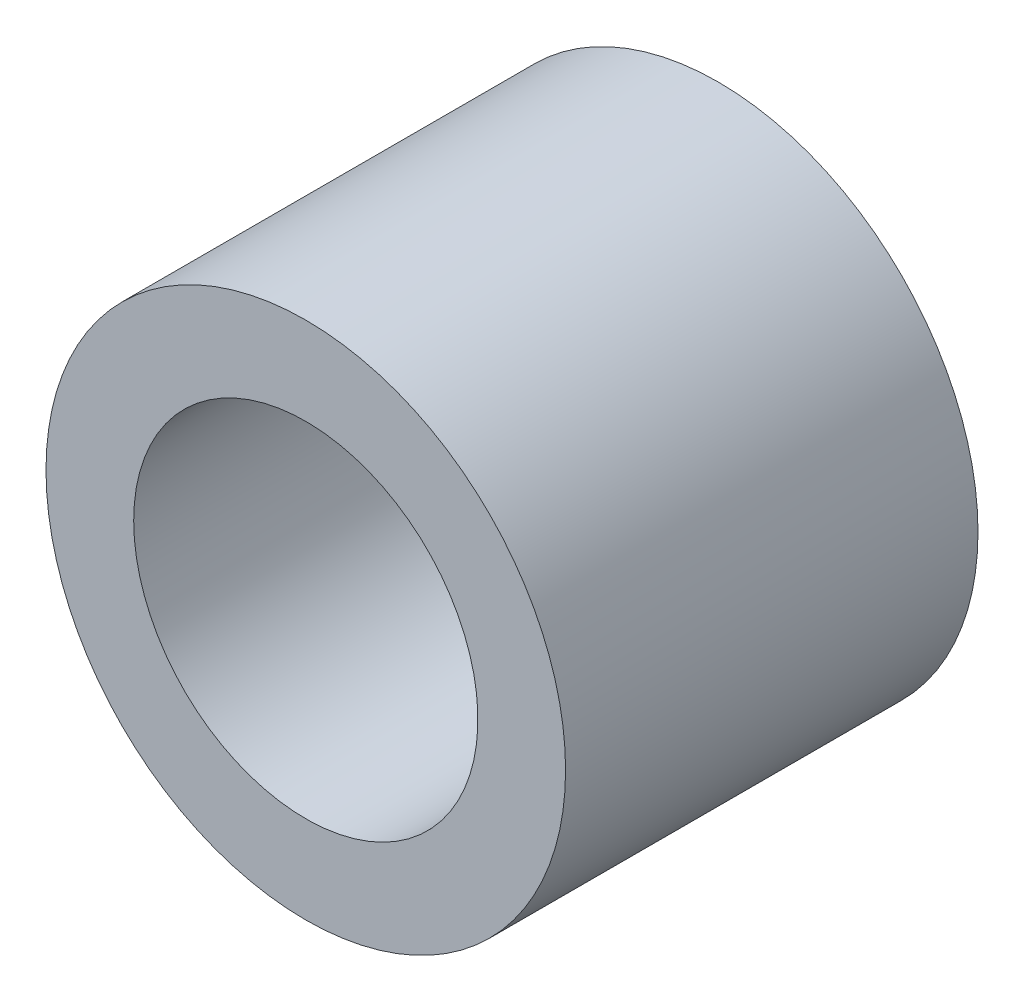
ISO-10303-21;
HEADER;
FILE_DESCRIPTION(('STEP AP214'),'2;1');
FILE_NAME('part.step','',(''),(''),'','','');
FILE_SCHEMA(('AUTOMOTIVE_DESIGN { 1 0 10303 214 1 1 1 1 }'));
ENDSEC;
DATA;
#1=APPLICATION_CONTEXT('core data for automotive mechanical design processes');
#2=APPLICATION_PROTOCOL_DEFINITION('international standard','automotive_design',2000,#1);
#3=PRODUCT_CONTEXT('',#1,'mechanical');
#4=PRODUCT('Part','Part','',(#3));
#5=PRODUCT_RELATED_PRODUCT_CATEGORY('part','',(#4));
#6=PRODUCT_DEFINITION_FORMATION('','',#4);
#7=PRODUCT_DEFINITION_CONTEXT('part definition',#1,'design');
#8=PRODUCT_DEFINITION('design','',#6,#7);
#9=PRODUCT_DEFINITION_SHAPE('','',#8);
#10=(LENGTH_UNIT() NAMED_UNIT(*) SI_UNIT(.MILLI.,.METRE.));
#11=(NAMED_UNIT(*) PLANE_ANGLE_UNIT() SI_UNIT($,.RADIAN.));
#12=(NAMED_UNIT(*) SI_UNIT($,.STERADIAN.) SOLID_ANGLE_UNIT());
#13=UNCERTAINTY_MEASURE_WITH_UNIT(LENGTH_MEASURE(1.E-05),#10,'distance_accuracy_value','');
#14=(GEOMETRIC_REPRESENTATION_CONTEXT(3) GLOBAL_UNCERTAINTY_ASSIGNED_CONTEXT((#13)) GLOBAL_UNIT_ASSIGNED_CONTEXT((#10,
#11,#12)) REPRESENTATION_CONTEXT('',''));
#15=CARTESIAN_POINT('',(0.,0.,0.));
#16=DIRECTION('',(0.,0.,1.));
#17=DIRECTION('',(1.,0.,0.));
#18=AXIS2_PLACEMENT_3D('',#15,#16,#17);
#19=CARTESIAN_POINT('',(0.,0.,3.175));
#20=DIRECTION('',(0.,0.,-1.));
#21=DIRECTION('',(-1.,0.,0.));
#22=AXIS2_PLACEMENT_3D('',#19,#20,#21);
#23=CYLINDRICAL_SURFACE('',#22,4.);
#24=CARTESIAN_POINT('',(0.,0.,3.175));
#25=DIRECTION('',(0.,0.,-1.));
#26=DIRECTION('',(-1.,0.,0.));
#27=AXIS2_PLACEMENT_3D('',#24,#25,#26);
#28=CIRCLE('',#27,4.);
#29=CARTESIAN_POINT('',(-4.,0.,3.175));
#30=VERTEX_POINT('',#29);
#31=EDGE_CURVE('E10',#30,#30,#28,.T.);
#32=ORIENTED_EDGE('',*,*,#31,.T.);
#33=EDGE_LOOP('',(#32));
#34=FACE_BOUND('',#33,.T.);
#35=CARTESIAN_POINT('',(0.,0.,-3.175));
#36=DIRECTION('',(0.,0.,-1.));
#37=DIRECTION('',(-1.,0.,0.));
#38=AXIS2_PLACEMENT_3D('',#35,#36,#37);
#39=CIRCLE('',#38,4.);
#40=CARTESIAN_POINT('',(-4.,0.,-3.175));
#41=VERTEX_POINT('',#40);
#42=EDGE_CURVE('E48',#41,#41,#39,.T.);
#43=ORIENTED_EDGE('',*,*,#42,.F.);
#44=EDGE_LOOP('',(#43));
#45=FACE_BOUND('',#44,.T.);
#46=ADVANCED_FACE('F34',(#34,#45),#23,.T.);
#47=CARTESIAN_POINT('',(4.,0.,3.175));
#48=DIRECTION('',(0.,0.,1.));
#49=DIRECTION('',(1.,0.,0.));
#50=AXIS2_PLACEMENT_3D('',#47,#48,#49);
#51=PLANE('',#50);
#52=CARTESIAN_POINT('',(0.,0.,3.175));
#53=DIRECTION('',(0.,0.,-1.));
#54=DIRECTION('',(-1.,0.,0.));
#55=AXIS2_PLACEMENT_3D('',#52,#53,#54);
#56=CIRCLE('',#55,2.65);
#57=CARTESIAN_POINT('',(-2.65,0.,3.175));
#58=VERTEX_POINT('',#57);
#59=EDGE_CURVE('E40',#58,#58,#56,.T.);
#60=ORIENTED_EDGE('',*,*,#59,.T.);
#61=EDGE_LOOP('',(#60));
#62=FACE_BOUND('',#61,.T.);
#63=ORIENTED_EDGE('',*,*,#31,.F.);
#64=EDGE_LOOP('',(#63));
#65=FACE_BOUND('',#64,.T.);
#66=ADVANCED_FACE('F58',(#62,#65),#51,.T.);
#67=CARTESIAN_POINT('',(0.,0.,3.175));
#68=DIRECTION('',(0.,0.,-1.));
#69=DIRECTION('',(-1.,0.,0.));
#70=AXIS2_PLACEMENT_3D('',#67,#68,#69);
#71=CYLINDRICAL_SURFACE('',#70,2.65);
#72=CARTESIAN_POINT('',(0.,0.,-3.175));
#73=DIRECTION('',(0.,0.,-1.));
#74=DIRECTION('',(-1.,0.,0.));
#75=AXIS2_PLACEMENT_3D('',#72,#73,#74);
#76=CIRCLE('',#75,2.65);
#77=CARTESIAN_POINT('',(-2.65,0.,-3.175));
#78=VERTEX_POINT('',#77);
#79=EDGE_CURVE('E44',#78,#78,#76,.T.);
#80=ORIENTED_EDGE('',*,*,#79,.T.);
#81=EDGE_LOOP('',(#80));
#82=FACE_BOUND('',#81,.T.);
#83=ORIENTED_EDGE('',*,*,#59,.F.);
#84=EDGE_LOOP('',(#83));
#85=FACE_BOUND('',#84,.T.);
#86=ADVANCED_FACE('F62',(#82,#85),#71,.F.);
#87=CARTESIAN_POINT('',(2.65,0.,-3.175));
#88=DIRECTION('',(0.,0.,-1.));
#89=DIRECTION('',(-1.,0.,0.));
#90=AXIS2_PLACEMENT_3D('',#87,#88,#89);
#91=PLANE('',#90);
#92=ORIENTED_EDGE('',*,*,#42,.T.);
#93=EDGE_LOOP('',(#92));
#94=FACE_BOUND('',#93,.T.);
#95=ORIENTED_EDGE('',*,*,#79,.F.);
#96=EDGE_LOOP('',(#95));
#97=FACE_BOUND('',#96,.T.);
#98=ADVANCED_FACE('F54',(#94,#97),#91,.T.);
#99=CLOSED_SHELL('',(#46,#66,#86,#98));
#100=MANIFOLD_SOLID_BREP('B2',#99);
#101=ADVANCED_BREP_SHAPE_REPRESENTATION('',(#18,#100),#14);
#102=SHAPE_DEFINITION_REPRESENTATION(#9,#101);
ENDSEC;
END-ISO-10303-21;
